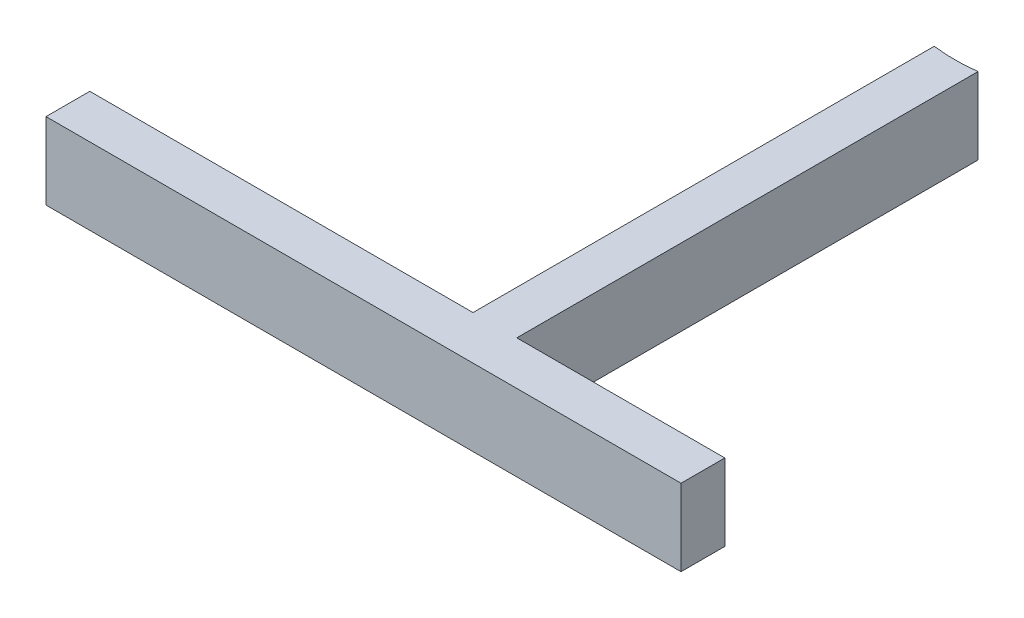
ISO-10303-21;
HEADER;
FILE_DESCRIPTION(('STEP AP214'),'2;1');
FILE_NAME('part.step','',(''),(''),'','','');
FILE_SCHEMA(('AUTOMOTIVE_DESIGN { 1 0 10303 214 1 1 1 1 }'));
ENDSEC;
DATA;
#1=APPLICATION_CONTEXT('core data for automotive mechanical design processes');
#2=APPLICATION_PROTOCOL_DEFINITION('international standard','automotive_design',2000,#1);
#3=PRODUCT_CONTEXT('',#1,'mechanical');
#4=PRODUCT('Part','Part','',(#3));
#5=PRODUCT_RELATED_PRODUCT_CATEGORY('part','',(#4));
#6=PRODUCT_DEFINITION_FORMATION('','',#4);
#7=PRODUCT_DEFINITION_CONTEXT('part definition',#1,'design');
#8=PRODUCT_DEFINITION('design','',#6,#7);
#9=PRODUCT_DEFINITION_SHAPE('','',#8);
#10=(LENGTH_UNIT() NAMED_UNIT(*) SI_UNIT(.MILLI.,.METRE.));
#11=(NAMED_UNIT(*) PLANE_ANGLE_UNIT() SI_UNIT($,.RADIAN.));
#12=(NAMED_UNIT(*) SI_UNIT($,.STERADIAN.) SOLID_ANGLE_UNIT());
#13=UNCERTAINTY_MEASURE_WITH_UNIT(LENGTH_MEASURE(1.E-05),#10,'distance_accuracy_value','');
#14=(GEOMETRIC_REPRESENTATION_CONTEXT(3) GLOBAL_UNCERTAINTY_ASSIGNED_CONTEXT((#13)) GLOBAL_UNIT_ASSIGNED_CONTEXT((#10,
#11,#12)) REPRESENTATION_CONTEXT('',''));
#15=CARTESIAN_POINT('',(0.,0.,0.));
#16=DIRECTION('',(0.,0.,1.));
#17=DIRECTION('',(1.,0.,0.));
#18=AXIS2_PLACEMENT_3D('',#15,#16,#17);
#19=CARTESIAN_POINT('',(-82.,8.5,-37.5016929108686));
#20=DIRECTION('',(-1.,0.,0.));
#21=DIRECTION('',(0.,0.,1.));
#22=AXIS2_PLACEMENT_3D('',#19,#20,#21);
#23=PLANE('',#22);
#24=DIRECTION('',(0.,0.,-1.));
#25=VECTOR('',#24,1.);
#26=CARTESIAN_POINT('',(-82.,1.5,-37.5016929108686));
#27=LINE('',#26,#25);
#28=CARTESIAN_POINT('',(-82.,1.5,-33.5016929108686));
#29=VERTEX_POINT('',#28);
#30=CARTESIAN_POINT('',(-82.,1.5,-37.5016929108686));
#31=VERTEX_POINT('',#30);
#32=EDGE_CURVE('E164',#29,#31,#27,.T.);
#33=ORIENTED_EDGE('',*,*,#32,.T.);
#34=DIRECTION('',(0.,-1.,0.));
#35=VECTOR('',#34,1.);
#36=CARTESIAN_POINT('',(-82.,8.5,-37.5016929108686));
#37=LINE('',#36,#35);
#38=CARTESIAN_POINT('',(-82.,8.5,-37.5016929108686));
#39=VERTEX_POINT('',#38);
#40=EDGE_CURVE('E175',#39,#31,#37,.T.);
#41=ORIENTED_EDGE('',*,*,#40,.F.);
#42=DIRECTION('',(0.,0.,-1.));
#43=VECTOR('',#42,1.);
#44=CARTESIAN_POINT('',(-82.,8.5,-37.5016929108686));
#45=LINE('',#44,#43);
#46=CARTESIAN_POINT('',(-82.,8.5,-33.5016929108686));
#47=VERTEX_POINT('',#46);
#48=EDGE_CURVE('E158',#47,#39,#45,.T.);
#49=ORIENTED_EDGE('',*,*,#48,.F.);
#50=DIRECTION('',(0.,-1.,0.));
#51=VECTOR('',#50,1.);
#52=CARTESIAN_POINT('',(-82.,8.5,-33.5016929108686));
#53=LINE('',#52,#51);
#54=EDGE_CURVE('E130',#47,#29,#53,.T.);
#55=ORIENTED_EDGE('',*,*,#54,.T.);
#56=EDGE_LOOP('',(#33,#41,#49,#55));
#57=FACE_BOUND('',#56,.T.);
#58=ADVANCED_FACE('F45',(#57),#23,.F.);
#59=CARTESIAN_POINT('',(-101.,8.5,-37.5016929108686));
#60=DIRECTION('',(0.,0.,1.));
#61=DIRECTION('',(1.,0.,0.));
#62=AXIS2_PLACEMENT_3D('',#59,#60,#61);
#63=PLANE('',#62);
#64=DIRECTION('',(-1.,0.,0.));
#65=VECTOR('',#64,1.);
#66=CARTESIAN_POINT('',(-101.,1.5,-37.5016929108686));
#67=LINE('',#66,#65);
#68=CARTESIAN_POINT('',(-101.,1.5,-37.5016929108686));
#69=VERTEX_POINT('',#68);
#70=EDGE_CURVE('E167',#31,#69,#67,.T.);
#71=ORIENTED_EDGE('',*,*,#70,.T.);
#72=DIRECTION('',(0.,-1.,0.));
#73=VECTOR('',#72,1.);
#74=CARTESIAN_POINT('',(-101.,8.5,-37.5016929108686));
#75=LINE('',#74,#73);
#76=CARTESIAN_POINT('',(-101.,8.5,-37.5016929108686));
#77=VERTEX_POINT('',#76);
#78=EDGE_CURVE('E172',#77,#69,#75,.T.);
#79=ORIENTED_EDGE('',*,*,#78,.F.);
#80=DIRECTION('',(-1.,0.,0.));
#81=VECTOR('',#80,1.);
#82=CARTESIAN_POINT('',(-101.,8.5,-37.5016929108686));
#83=LINE('',#82,#81);
#84=EDGE_CURVE('E160',#39,#77,#83,.T.);
#85=ORIENTED_EDGE('',*,*,#84,.F.);
#86=ORIENTED_EDGE('',*,*,#40,.T.);
#87=EDGE_LOOP('',(#71,#79,#85,#86));
#88=FACE_BOUND('',#87,.T.);
#89=ADVANCED_FACE('F189',(#88),#63,.F.);
#90=CARTESIAN_POINT('',(-140.,8.5,-37.5016929108686));
#91=DIRECTION('',(0.,0.,1.));
#92=DIRECTION('',(1.,0.,0.));
#93=AXIS2_PLACEMENT_3D('',#90,#91,#92);
#94=PLANE('',#93);
#95=DIRECTION('',(-1.,0.,0.));
#96=VECTOR('',#95,1.);
#97=CARTESIAN_POINT('',(-140.,1.5,-37.5016929108686));
#98=LINE('',#97,#96);
#99=CARTESIAN_POINT('',(-105.,1.5,-37.5016929108686));
#100=VERTEX_POINT('',#99);
#101=CARTESIAN_POINT('',(-140.,1.5,-37.5016929108686));
#102=VERTEX_POINT('',#101);
#103=EDGE_CURVE('E107',#100,#102,#98,.T.);
#104=ORIENTED_EDGE('',*,*,#103,.T.);
#105=DIRECTION('',(0.,-1.,0.));
#106=VECTOR('',#105,1.);
#107=CARTESIAN_POINT('',(-140.,8.5,-37.5016929108686));
#108=LINE('',#107,#106);
#109=CARTESIAN_POINT('',(-140.,8.5,-37.5016929108686));
#110=VERTEX_POINT('',#109);
#111=EDGE_CURVE('E120',#110,#102,#108,.T.);
#112=ORIENTED_EDGE('',*,*,#111,.F.);
#113=DIRECTION('',(-1.,0.,0.));
#114=VECTOR('',#113,1.);
#115=CARTESIAN_POINT('',(-140.,8.5,-37.5016929108686));
#116=LINE('',#115,#114);
#117=CARTESIAN_POINT('',(-105.,8.5,-37.5016929108686));
#118=VERTEX_POINT('',#117);
#119=EDGE_CURVE('E153',#118,#110,#116,.T.);
#120=ORIENTED_EDGE('',*,*,#119,.F.);
#121=DIRECTION('',(0.,-1.,0.));
#122=VECTOR('',#121,1.);
#123=CARTESIAN_POINT('',(-105.,8.5,-37.5016929108686));
#124=LINE('',#123,#122);
#125=EDGE_CURVE('E123',#118,#100,#124,.T.);
#126=ORIENTED_EDGE('',*,*,#125,.T.);
#127=EDGE_LOOP('',(#104,#112,#120,#126));
#128=FACE_BOUND('',#127,.T.);
#129=ADVANCED_FACE('F118',(#128),#94,.F.);
#130=CARTESIAN_POINT('',(-82.,8.5,-33.5016929108686));
#131=DIRECTION('',(0.,0.,-1.));
#132=DIRECTION('',(-1.,0.,0.));
#133=AXIS2_PLACEMENT_3D('',#130,#131,#132);
#134=PLANE('',#133);
#135=DIRECTION('',(1.,0.,0.));
#136=VECTOR('',#135,1.);
#137=CARTESIAN_POINT('',(-82.,1.5,-33.5016929108686));
#138=LINE('',#137,#136);
#139=CARTESIAN_POINT('',(-140.,1.5,-33.5016929108686));
#140=VERTEX_POINT('',#139);
#141=EDGE_CURVE('E110',#140,#29,#138,.T.);
#142=ORIENTED_EDGE('',*,*,#141,.T.);
#143=ORIENTED_EDGE('',*,*,#54,.F.);
#144=DIRECTION('',(1.,0.,0.));
#145=VECTOR('',#144,1.);
#146=CARTESIAN_POINT('',(-82.,8.5,-33.5016929108686));
#147=LINE('',#146,#145);
#148=CARTESIAN_POINT('',(-140.,8.5,-33.5016929108686));
#149=VERTEX_POINT('',#148);
#150=EDGE_CURVE('E156',#149,#47,#147,.T.);
#151=ORIENTED_EDGE('',*,*,#150,.F.);
#152=DIRECTION('',(0.,-1.,0.));
#153=VECTOR('',#152,1.);
#154=CARTESIAN_POINT('',(-140.,8.5,-33.5016929108686));
#155=LINE('',#154,#153);
#156=EDGE_CURVE('E127',#149,#140,#155,.T.);
#157=ORIENTED_EDGE('',*,*,#156,.T.);
#158=EDGE_LOOP('',(#142,#143,#151,#157));
#159=FACE_BOUND('',#158,.T.);
#160=ADVANCED_FACE('F184',(#159),#134,.F.);
#161=CARTESIAN_POINT('',(-101.,8.5,-37.5016929108686));
#162=DIRECTION('',(-1.,0.,0.));
#163=DIRECTION('',(0.,0.,1.));
#164=AXIS2_PLACEMENT_3D('',#161,#162,#163);
#165=PLANE('',#164);
#166=DIRECTION('',(0.,0.,-1.));
#167=VECTOR('',#166,1.);
#168=CARTESIAN_POINT('',(-101.,1.5,-37.5016929108686));
#169=LINE('',#168,#167);
#170=CARTESIAN_POINT('',(-101.,1.5,-79.6254921336125));
#171=VERTEX_POINT('',#170);
#172=EDGE_CURVE('E151',#69,#171,#169,.T.);
#173=ORIENTED_EDGE('',*,*,#172,.T.);
#174=DIRECTION('',(0.,-1.,0.));
#175=VECTOR('',#174,1.);
#176=CARTESIAN_POINT('',(-101.,8.5,-79.6254921336125));
#177=LINE('',#176,#175);
#178=CARTESIAN_POINT('',(-101.,8.5,-79.6254921336125));
#179=VERTEX_POINT('',#178);
#180=EDGE_CURVE('E145',#179,#171,#177,.T.);
#181=ORIENTED_EDGE('',*,*,#180,.F.);
#182=DIRECTION('',(0.,0.,-1.));
#183=VECTOR('',#182,1.);
#184=CARTESIAN_POINT('',(-101.,8.5,-37.5016929108686));
#185=LINE('',#184,#183);
#186=EDGE_CURVE('E61',#77,#179,#185,.T.);
#187=ORIENTED_EDGE('',*,*,#186,.F.);
#188=ORIENTED_EDGE('',*,*,#78,.T.);
#189=EDGE_LOOP('',(#173,#181,#187,#188));
#190=FACE_BOUND('',#189,.T.);
#191=ADVANCED_FACE('F191',(#190),#165,.F.);
#192=CARTESIAN_POINT('',(-103.,8.5,-95.5));
#193=DIRECTION('',(0.,-1.,0.));
#194=DIRECTION('',(0.,0.,-1.));
#195=AXIS2_PLACEMENT_3D('',#192,#193,#194);
#196=PLANE('',#195);
#197=CARTESIAN_POINT('',(-103.,8.5,-95.5));
#198=DIRECTION('',(0.,-1.,0.));
#199=DIRECTION('',(0.,0.,-1.));
#200=AXIS2_PLACEMENT_3D('',#197,#198,#199);
#201=CIRCLE('',#200,16.);
#202=CARTESIAN_POINT('',(-105.,8.5,-79.6254921336125));
#203=VERTEX_POINT('',#202);
#204=EDGE_CURVE('E143',#179,#203,#201,.T.);
#205=ORIENTED_EDGE('',*,*,#204,.T.);
#206=DIRECTION('',(0.,0.,1.));
#207=VECTOR('',#206,1.);
#208=CARTESIAN_POINT('',(-105.,8.5,-37.5016929108686));
#209=LINE('',#208,#207);
#210=EDGE_CURVE('E137',#203,#118,#209,.T.);
#211=ORIENTED_EDGE('',*,*,#210,.T.);
#212=ORIENTED_EDGE('',*,*,#119,.T.);
#213=DIRECTION('',(0.,0.,1.));
#214=VECTOR('',#213,1.);
#215=CARTESIAN_POINT('',(-140.,8.5,-33.5016929108686));
#216=LINE('',#215,#214);
#217=EDGE_CURVE('E126',#110,#149,#216,.T.);
#218=ORIENTED_EDGE('',*,*,#217,.T.);
#219=ORIENTED_EDGE('',*,*,#150,.T.);
#220=ORIENTED_EDGE('',*,*,#48,.T.);
#221=ORIENTED_EDGE('',*,*,#84,.T.);
#222=ORIENTED_EDGE('',*,*,#186,.T.);
#223=EDGE_LOOP('',(#205,#211,#212,#218,#219,#220,#221,#222));
#224=FACE_BOUND('',#223,.T.);
#225=ADVANCED_FACE('F185',(#224),#196,.F.);
#226=CARTESIAN_POINT('',(-105.,8.5,-37.5016929108686));
#227=DIRECTION('',(1.,0.,0.));
#228=DIRECTION('',(0.,0.,-1.));
#229=AXIS2_PLACEMENT_3D('',#226,#227,#228);
#230=PLANE('',#229);
#231=DIRECTION('',(0.,0.,1.));
#232=VECTOR('',#231,1.);
#233=CARTESIAN_POINT('',(-105.,1.5,-37.5016929108686));
#234=LINE('',#233,#232);
#235=CARTESIAN_POINT('',(-105.,1.5,-79.6254921336125));
#236=VERTEX_POINT('',#235);
#237=EDGE_CURVE('E124',#236,#100,#234,.T.);
#238=ORIENTED_EDGE('',*,*,#237,.T.);
#239=ORIENTED_EDGE('',*,*,#125,.F.);
#240=ORIENTED_EDGE('',*,*,#210,.F.);
#241=DIRECTION('',(0.,-1.,0.));
#242=VECTOR('',#241,1.);
#243=CARTESIAN_POINT('',(-105.,8.5,-79.6254921336125));
#244=LINE('',#243,#242);
#245=EDGE_CURVE('E54',#203,#236,#244,.T.);
#246=ORIENTED_EDGE('',*,*,#245,.T.);
#247=EDGE_LOOP('',(#238,#239,#240,#246));
#248=FACE_BOUND('',#247,.T.);
#249=ADVANCED_FACE('F136',(#248),#230,.F.);
#250=CARTESIAN_POINT('',(-103.,1.5,-95.5));
#251=DIRECTION('',(0.,-1.,0.));
#252=DIRECTION('',(0.,0.,-1.));
#253=AXIS2_PLACEMENT_3D('',#250,#251,#252);
#254=CYLINDRICAL_SURFACE('',#253,16.);
#255=CARTESIAN_POINT('',(-103.,1.5,-95.5));
#256=DIRECTION('',(0.,1.,0.));
#257=DIRECTION('',(0.,0.,1.));
#258=AXIS2_PLACEMENT_3D('',#255,#256,#257);
#259=CIRCLE('',#258,16.);
#260=EDGE_CURVE('E144',#236,#171,#259,.T.);
#261=ORIENTED_EDGE('',*,*,#260,.F.);
#262=ORIENTED_EDGE('',*,*,#245,.F.);
#263=ORIENTED_EDGE('',*,*,#204,.F.);
#264=ORIENTED_EDGE('',*,*,#180,.T.);
#265=EDGE_LOOP('',(#261,#262,#263,#264));
#266=FACE_BOUND('',#265,.T.);
#267=ADVANCED_FACE('F141',(#266),#254,.F.);
#268=CARTESIAN_POINT('',(-140.,1.5,140.));
#269=DIRECTION('',(1.,0.,0.));
#270=DIRECTION('',(0.,0.,-1.));
#271=AXIS2_PLACEMENT_3D('',#268,#269,#270);
#272=PLANE('',#271);
#273=ORIENTED_EDGE('',*,*,#111,.T.);
#274=DIRECTION('',(0.,0.,1.));
#275=VECTOR('',#274,1.);
#276=CARTESIAN_POINT('',(-140.,1.5,140.));
#277=LINE('',#276,#275);
#278=EDGE_CURVE('E11',#102,#140,#277,.T.);
#279=ORIENTED_EDGE('',*,*,#278,.T.);
#280=ORIENTED_EDGE('',*,*,#156,.F.);
#281=ORIENTED_EDGE('',*,*,#217,.F.);
#282=EDGE_LOOP('',(#273,#279,#280,#281));
#283=FACE_BOUND('',#282,.T.);
#284=ADVANCED_FACE('F47',(#283),#272,.F.);
#285=CARTESIAN_POINT('',(-77.5150477768192,1.5,-90.0852490004539));
#286=DIRECTION('',(0.,1.,0.));
#287=DIRECTION('',(0.,0.,1.));
#288=AXIS2_PLACEMENT_3D('',#285,#286,#287);
#289=PLANE('',#288);
#290=ORIENTED_EDGE('',*,*,#278,.F.);
#291=ORIENTED_EDGE('',*,*,#103,.F.);
#292=ORIENTED_EDGE('',*,*,#237,.F.);
#293=ORIENTED_EDGE('',*,*,#260,.T.);
#294=ORIENTED_EDGE('',*,*,#172,.F.);
#295=ORIENTED_EDGE('',*,*,#70,.F.);
#296=ORIENTED_EDGE('',*,*,#32,.F.);
#297=ORIENTED_EDGE('',*,*,#141,.F.);
#298=EDGE_LOOP('',(#290,#291,#292,#293,#294,#295,#296,#297));
#299=FACE_BOUND('',#298,.T.);
#300=ADVANCED_FACE('F106',(#299),#289,.F.);
#301=CLOSED_SHELL('',(#58,#89,#129,#160,#191,#225,#249,#267,#284,#300));
#302=MANIFOLD_SOLID_BREP('B2',#301);
#303=ADVANCED_BREP_SHAPE_REPRESENTATION('',(#18,#302),#14);
#304=SHAPE_DEFINITION_REPRESENTATION(#9,#303);
ENDSEC;
END-ISO-10303-21;
